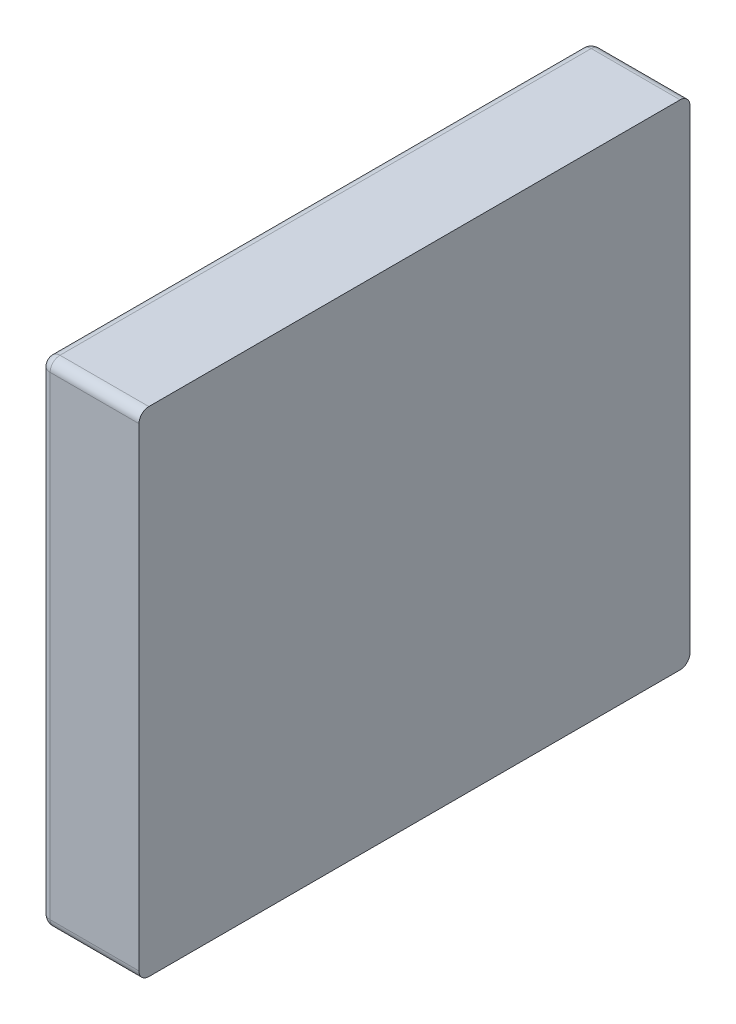
ISO-10303-21;
HEADER;
FILE_DESCRIPTION(('STEP AP214'),'2;1');
FILE_NAME('part.step','',(''),(''),'','','');
FILE_SCHEMA(('AUTOMOTIVE_DESIGN { 1 0 10303 214 1 1 1 1 }'));
ENDSEC;
DATA;
#1=APPLICATION_CONTEXT('core data for automotive mechanical design processes');
#2=APPLICATION_PROTOCOL_DEFINITION('international standard','automotive_design',2000,#1);
#3=PRODUCT_CONTEXT('',#1,'mechanical');
#4=PRODUCT('Part','Part','',(#3));
#5=PRODUCT_RELATED_PRODUCT_CATEGORY('part','',(#4));
#6=PRODUCT_DEFINITION_FORMATION('','',#4);
#7=PRODUCT_DEFINITION_CONTEXT('part definition',#1,'design');
#8=PRODUCT_DEFINITION('design','',#6,#7);
#9=PRODUCT_DEFINITION_SHAPE('','',#8);
#10=(LENGTH_UNIT() NAMED_UNIT(*) SI_UNIT(.MILLI.,.METRE.));
#11=(NAMED_UNIT(*) PLANE_ANGLE_UNIT() SI_UNIT($,.RADIAN.));
#12=(NAMED_UNIT(*) SI_UNIT($,.STERADIAN.) SOLID_ANGLE_UNIT());
#13=UNCERTAINTY_MEASURE_WITH_UNIT(LENGTH_MEASURE(1.E-05),#10,'distance_accuracy_value','');
#14=(GEOMETRIC_REPRESENTATION_CONTEXT(3) GLOBAL_UNCERTAINTY_ASSIGNED_CONTEXT((#13)) GLOBAL_UNIT_ASSIGNED_CONTEXT((#10,
#11,#12)) REPRESENTATION_CONTEXT('',''));
#15=CARTESIAN_POINT('',(0.,0.,0.));
#16=DIRECTION('',(0.,0.,1.));
#17=DIRECTION('',(1.,0.,0.));
#18=AXIS2_PLACEMENT_3D('',#15,#16,#17);
#19=CARTESIAN_POINT('',(1.65,1.25,0.));
#20=DIRECTION('',(0.,1.,0.));
#21=DIRECTION('',(-1.,0.,0.));
#22=AXIS2_PLACEMENT_3D('',#19,#20,#21);
#23=PLANE('',#22);
#24=DIRECTION('',(0.,0.,-1.));
#25=VECTOR('',#24,1.);
#26=CARTESIAN_POINT('',(-1.15,1.25,1.395));
#27=LINE('',#26,#25);
#28=CARTESIAN_POINT('',(-1.15,1.25,2.74));
#29=VERTEX_POINT('',#28);
#30=CARTESIAN_POINT('',(-1.15,1.25,0.05));
#31=VERTEX_POINT('',#30);
#32=EDGE_CURVE('E11',#29,#31,#27,.T.);
#33=ORIENTED_EDGE('',*,*,#32,.T.);
#34=DIRECTION('',(1.,0.,0.));
#35=VECTOR('',#34,1.);
#36=CARTESIAN_POINT('',(0.825,1.25,0.05));
#37=LINE('',#36,#35);
#38=CARTESIAN_POINT('',(-1.6,1.25,0.05));
#39=VERTEX_POINT('',#38);
#40=EDGE_CURVE('E24',#39,#31,#37,.T.);
#41=ORIENTED_EDGE('',*,*,#40,.F.);
#42=DIRECTION('',(0.,0.,-1.));
#43=VECTOR('',#42,1.);
#44=CARTESIAN_POINT('',(-1.6,1.25,0.));
#45=LINE('',#44,#43);
#46=CARTESIAN_POINT('',(-1.6,1.25,2.74));
#47=VERTEX_POINT('',#46);
#48=EDGE_CURVE('E265',#47,#39,#45,.T.);
#49=ORIENTED_EDGE('',*,*,#48,.F.);
#50=DIRECTION('',(-1.,0.,0.));
#51=VECTOR('',#50,1.);
#52=CARTESIAN_POINT('',(0.825,1.25,2.74));
#53=LINE('',#52,#51);
#54=EDGE_CURVE('E268',#29,#47,#53,.T.);
#55=ORIENTED_EDGE('',*,*,#54,.F.);
#56=EDGE_LOOP('',(#33,#41,#49,#55));
#57=FACE_BOUND('',#56,.T.);
#58=ADVANCED_FACE('F17',(#57),#23,.T.);
#59=CARTESIAN_POINT('',(-1.6,1.2,0.));
#60=DIRECTION('',(0.,0.,1.));
#61=DIRECTION('',(-0.707106781186548,0.707106781186548,0.));
#62=AXIS2_PLACEMENT_3D('',#59,#60,#61);
#63=CYLINDRICAL_SURFACE('',#62,0.05);
#64=CARTESIAN_POINT('',(-1.6,1.2,0.05));
#65=DIRECTION('',(0.,0.,-1.));
#66=DIRECTION('',(-0.707106781186546,0.707106781186549,0.));
#67=AXIS2_PLACEMENT_3D('',#64,#65,#66);
#68=CIRCLE('',#67,0.0499999999999999);
#69=CARTESIAN_POINT('',(-1.65,1.2,0.05));
#70=VERTEX_POINT('',#69);
#71=EDGE_CURVE('E260',#70,#39,#68,.T.);
#72=ORIENTED_EDGE('',*,*,#71,.F.);
#73=DIRECTION('',(0.,0.,1.));
#74=VECTOR('',#73,1.);
#75=CARTESIAN_POINT('',(-1.65,1.2,0.));
#76=LINE('',#75,#74);
#77=CARTESIAN_POINT('',(-1.65,1.2,2.74));
#78=VERTEX_POINT('',#77);
#79=EDGE_CURVE('E263',#70,#78,#76,.T.);
#80=ORIENTED_EDGE('',*,*,#79,.T.);
#81=CARTESIAN_POINT('',(-1.6,1.2,2.74));
#82=DIRECTION('',(0.,0.,1.));
#83=DIRECTION('',(-0.707106781186546,0.707106781186549,0.));
#84=AXIS2_PLACEMENT_3D('',#81,#82,#83);
#85=CIRCLE('',#84,0.0499999999999999);
#86=EDGE_CURVE('E275',#47,#78,#85,.T.);
#87=ORIENTED_EDGE('',*,*,#86,.F.);
#88=ORIENTED_EDGE('',*,*,#48,.T.);
#89=EDGE_LOOP('',(#72,#80,#87,#88));
#90=FACE_BOUND('',#89,.T.);
#91=ADVANCED_FACE('F250',(#90),#63,.T.);
#92=CARTESIAN_POINT('',(-1.65,1.25,0.));
#93=DIRECTION('',(-1.,0.,0.));
#94=DIRECTION('',(0.,-1.,0.));
#95=AXIS2_PLACEMENT_3D('',#92,#93,#94);
#96=PLANE('',#95);
#97=DIRECTION('',(0.,1.,0.));
#98=VECTOR('',#97,1.);
#99=CARTESIAN_POINT('',(-1.65,0.624999999999999,0.05));
#100=LINE('',#99,#98);
#101=CARTESIAN_POINT('',(-1.65,-1.2,0.05));
#102=VERTEX_POINT('',#101);
#103=EDGE_CURVE('E271',#102,#70,#100,.T.);
#104=ORIENTED_EDGE('',*,*,#103,.F.);
#105=DIRECTION('',(0.,0.,-1.));
#106=VECTOR('',#105,1.);
#107=CARTESIAN_POINT('',(-1.65,-1.2,0.));
#108=LINE('',#107,#106);
#109=CARTESIAN_POINT('',(-1.65,-1.2,2.74));
#110=VERTEX_POINT('',#109);
#111=EDGE_CURVE('E278',#110,#102,#108,.T.);
#112=ORIENTED_EDGE('',*,*,#111,.F.);
#113=DIRECTION('',(0.,-1.,0.));
#114=VECTOR('',#113,1.);
#115=CARTESIAN_POINT('',(-1.65,0.624999999999999,2.74));
#116=LINE('',#115,#114);
#117=EDGE_CURVE('E274',#78,#110,#116,.T.);
#118=ORIENTED_EDGE('',*,*,#117,.F.);
#119=ORIENTED_EDGE('',*,*,#79,.F.);
#120=EDGE_LOOP('',(#104,#112,#118,#119));
#121=FACE_BOUND('',#120,.T.);
#122=ADVANCED_FACE('F246',(#121),#96,.T.);
#123=CARTESIAN_POINT('',(-1.6,-1.2,2.74));
#124=DIRECTION('',(0.408248290463864,-0.816496580927728,-0.408248290463859));
#125=DIRECTION('',(-0.577350269189629,-0.577350269189624,0.577350269189625));
#126=AXIS2_PLACEMENT_3D('',#123,#124,#125);
#127=SPHERICAL_SURFACE('',#126,0.05);
#128=CARTESIAN_POINT('',(-1.6,-1.2,2.74));
#129=DIRECTION('',(0.,1.,0.));
#130=DIRECTION('',(-1.,0.,0.));
#131=AXIS2_PLACEMENT_3D('',#128,#129,#130);
#132=CIRCLE('',#131,0.0499999999999998);
#133=CARTESIAN_POINT('',(-1.6,-1.2,2.79));
#134=VERTEX_POINT('',#133);
#135=EDGE_CURVE('E319',#110,#134,#132,.T.);
#136=ORIENTED_EDGE('',*,*,#135,.F.);
#137=CARTESIAN_POINT('',(-1.6,-1.2,2.74));
#138=DIRECTION('',(0.,0.,1.));
#139=DIRECTION('',(-0.707106781186546,-0.707106781186549,0.));
#140=AXIS2_PLACEMENT_3D('',#137,#138,#139);
#141=CIRCLE('',#140,0.0499999999999999);
#142=CARTESIAN_POINT('',(-1.6,-1.25,2.74));
#143=VERTEX_POINT('',#142);
#144=EDGE_CURVE('E317',#110,#143,#141,.T.);
#145=ORIENTED_EDGE('',*,*,#144,.T.);
#146=CARTESIAN_POINT('',(-1.6,-1.2,2.74));
#147=DIRECTION('',(1.,0.,0.));
#148=DIRECTION('',(0.,0.,1.));
#149=AXIS2_PLACEMENT_3D('',#146,#147,#148);
#150=CIRCLE('',#149,0.0500000000000001);
#151=EDGE_CURVE('E228',#134,#143,#150,.T.);
#152=ORIENTED_EDGE('',*,*,#151,.F.);
#153=EDGE_LOOP('',(#136,#145,#152));
#154=FACE_BOUND('',#153,.T.);
#155=ADVANCED_FACE('F235',(#154),#127,.T.);
#156=CARTESIAN_POINT('',(-1.6,1.2,2.74));
#157=DIRECTION('',(-0.408248290463864,-0.816496580927728,0.408248290463859));
#158=DIRECTION('',(-0.57735026918963,0.577350269189624,0.577350269189625));
#159=AXIS2_PLACEMENT_3D('',#156,#157,#158);
#160=SPHERICAL_SURFACE('',#159,0.05);
#161=CARTESIAN_POINT('',(-1.6,1.2,2.74));
#162=DIRECTION('',(1.,0.,0.));
#163=DIRECTION('',(0.,1.,0.));
#164=AXIS2_PLACEMENT_3D('',#161,#162,#163);
#165=CIRCLE('',#164,0.05);
#166=CARTESIAN_POINT('',(-1.6,1.2,2.79));
#167=VERTEX_POINT('',#166);
#168=EDGE_CURVE('E226',#47,#167,#165,.T.);
#169=ORIENTED_EDGE('',*,*,#168,.F.);
#170=ORIENTED_EDGE('',*,*,#86,.T.);
#171=CARTESIAN_POINT('',(-1.6,1.2,2.74));
#172=DIRECTION('',(0.,-1.,0.));
#173=DIRECTION('',(0.,0.,1.));
#174=AXIS2_PLACEMENT_3D('',#171,#172,#173);
#175=CIRCLE('',#174,0.05);
#176=EDGE_CURVE('E223',#167,#78,#175,.T.);
#177=ORIENTED_EDGE('',*,*,#176,.F.);
#178=EDGE_LOOP('',(#169,#170,#177));
#179=FACE_BOUND('',#178,.T.);
#180=ADVANCED_FACE('F245',(#179),#160,.T.);
#181=CARTESIAN_POINT('',(0.825,1.2,2.74));
#182=DIRECTION('',(-1.,0.,0.));
#183=DIRECTION('',(0.,0.707106781186548,0.707106781186548));
#184=AXIS2_PLACEMENT_3D('',#181,#182,#183);
#185=CYLINDRICAL_SURFACE('',#184,0.05);
#186=CARTESIAN_POINT('',(-1.15,1.2,2.74));
#187=DIRECTION('',(-1.,0.,0.));
#188=DIRECTION('',(0.,0.707106781186548,0.707106781186548));
#189=AXIS2_PLACEMENT_3D('',#186,#187,#188);
#190=CIRCLE('',#189,0.05);
#191=CARTESIAN_POINT('',(-1.15,1.2,2.79));
#192=VERTEX_POINT('',#191);
#193=EDGE_CURVE('E220',#192,#29,#190,.T.);
#194=ORIENTED_EDGE('',*,*,#193,.T.);
#195=ORIENTED_EDGE('',*,*,#54,.T.);
#196=ORIENTED_EDGE('',*,*,#168,.T.);
#197=DIRECTION('',(1.,0.,0.));
#198=VECTOR('',#197,1.);
#199=CARTESIAN_POINT('',(0.825,1.2,2.79));
#200=LINE('',#199,#198);
#201=EDGE_CURVE('E217',#167,#192,#200,.T.);
#202=ORIENTED_EDGE('',*,*,#201,.T.);
#203=EDGE_LOOP('',(#194,#195,#196,#202));
#204=FACE_BOUND('',#203,.T.);
#205=ADVANCED_FACE('F339',(#204),#185,.T.);
#206=CARTESIAN_POINT('',(-1.6,0.624999999999999,2.74));
#207=DIRECTION('',(0.,-1.,0.));
#208=DIRECTION('',(-0.707106781186548,0.,0.707106781186548));
#209=AXIS2_PLACEMENT_3D('',#206,#207,#208);
#210=CYLINDRICAL_SURFACE('',#209,0.05);
#211=ORIENTED_EDGE('',*,*,#176,.T.);
#212=ORIENTED_EDGE('',*,*,#117,.T.);
#213=ORIENTED_EDGE('',*,*,#135,.T.);
#214=DIRECTION('',(0.,1.,0.));
#215=VECTOR('',#214,1.);
#216=CARTESIAN_POINT('',(-1.6,0.624999999999999,2.79));
#217=LINE('',#216,#215);
#218=EDGE_CURVE('E212',#134,#167,#217,.T.);
#219=ORIENTED_EDGE('',*,*,#218,.T.);
#220=EDGE_LOOP('',(#211,#212,#213,#219));
#221=FACE_BOUND('',#220,.T.);
#222=ADVANCED_FACE('F347',(#221),#210,.T.);
#223=CARTESIAN_POINT('',(0.,0.,0.));
#224=DIRECTION('',(0.,0.,1.));
#225=DIRECTION('',(1.,0.,0.));
#226=AXIS2_PLACEMENT_3D('',#223,#224,#225);
#227=PLANE('',#226);
#228=DIRECTION('',(0.,-1.,0.));
#229=VECTOR('',#228,1.);
#230=CARTESIAN_POINT('',(-1.15,-0.705746188975897,0.));
#231=LINE('',#230,#229);
#232=CARTESIAN_POINT('',(-1.15,1.2,0.));
#233=VERTEX_POINT('',#232);
#234=CARTESIAN_POINT('',(-1.15,-1.2,0.));
#235=VERTEX_POINT('',#234);
#236=EDGE_CURVE('E210',#233,#235,#231,.T.);
#237=ORIENTED_EDGE('',*,*,#236,.T.);
#238=DIRECTION('',(1.,0.,0.));
#239=VECTOR('',#238,1.);
#240=CARTESIAN_POINT('',(-0.825,-1.2,0.));
#241=LINE('',#240,#239);
#242=CARTESIAN_POINT('',(-1.6,-1.2,0.));
#243=VERTEX_POINT('',#242);
#244=EDGE_CURVE('E95',#243,#235,#241,.T.);
#245=ORIENTED_EDGE('',*,*,#244,.F.);
#246=DIRECTION('',(0.,-1.,0.));
#247=VECTOR('',#246,1.);
#248=CARTESIAN_POINT('',(-1.6,0.624999999999999,0.));
#249=LINE('',#248,#247);
#250=CARTESIAN_POINT('',(-1.6,1.2,0.));
#251=VERTEX_POINT('',#250);
#252=EDGE_CURVE('E203',#251,#243,#249,.T.);
#253=ORIENTED_EDGE('',*,*,#252,.F.);
#254=DIRECTION('',(-1.,0.,0.));
#255=VECTOR('',#254,1.);
#256=CARTESIAN_POINT('',(0.825,1.2,0.));
#257=LINE('',#256,#255);
#258=EDGE_CURVE('E198',#233,#251,#257,.T.);
#259=ORIENTED_EDGE('',*,*,#258,.F.);
#260=EDGE_LOOP('',(#237,#245,#253,#259));
#261=FACE_BOUND('',#260,.T.);
#262=ADVANCED_FACE('F352',(#261),#227,.F.);
#263=CARTESIAN_POINT('',(-1.6,-1.2,0.));
#264=DIRECTION('',(0.,0.,1.));
#265=DIRECTION('',(-0.707106781186548,-0.707106781186548,0.));
#266=AXIS2_PLACEMENT_3D('',#263,#264,#265);
#267=CYLINDRICAL_SURFACE('',#266,0.05);
#268=CARTESIAN_POINT('',(-1.6,-1.2,0.05));
#269=DIRECTION('',(0.,0.,-1.));
#270=DIRECTION('',(-0.707106781186546,-0.707106781186549,0.));
#271=AXIS2_PLACEMENT_3D('',#268,#269,#270);
#272=CIRCLE('',#271,0.0499999999999999);
#273=CARTESIAN_POINT('',(-1.6,-1.25,0.05));
#274=VERTEX_POINT('',#273);
#275=EDGE_CURVE('E194',#274,#102,#272,.T.);
#276=ORIENTED_EDGE('',*,*,#275,.F.);
#277=DIRECTION('',(0.,0.,1.));
#278=VECTOR('',#277,1.);
#279=CARTESIAN_POINT('',(-1.6,-1.25,0.));
#280=LINE('',#279,#278);
#281=EDGE_CURVE('E106',#274,#143,#280,.T.);
#282=ORIENTED_EDGE('',*,*,#281,.T.);
#283=ORIENTED_EDGE('',*,*,#144,.F.);
#284=ORIENTED_EDGE('',*,*,#111,.T.);
#285=EDGE_LOOP('',(#276,#282,#283,#284));
#286=FACE_BOUND('',#285,.T.);
#287=ADVANCED_FACE('F155',(#286),#267,.T.);
#288=CARTESIAN_POINT('',(-1.6,-1.2,0.05));
#289=DIRECTION('',(0.408248290463864,0.40824829046386,-0.816496580927727));
#290=DIRECTION('',(-0.577350269189628,-0.577350269189625,-0.577350269189624));
#291=AXIS2_PLACEMENT_3D('',#288,#289,#290);
#292=SPHERICAL_SURFACE('',#291,0.05);
#293=CARTESIAN_POINT('',(-1.6,-1.2,0.05));
#294=DIRECTION('',(1.,0.,0.));
#295=DIRECTION('',(0.,-1.,0.));
#296=AXIS2_PLACEMENT_3D('',#293,#294,#295);
#297=CIRCLE('',#296,0.05);
#298=EDGE_CURVE('E189',#274,#243,#297,.T.);
#299=ORIENTED_EDGE('',*,*,#298,.F.);
#300=ORIENTED_EDGE('',*,*,#275,.T.);
#301=CARTESIAN_POINT('',(-1.6,-1.2,0.05));
#302=DIRECTION('',(0.,1.,0.));
#303=DIRECTION('',(0.,0.,-1.));
#304=AXIS2_PLACEMENT_3D('',#301,#302,#303);
#305=CIRCLE('',#304,0.05);
#306=EDGE_CURVE('E174',#243,#102,#305,.T.);
#307=ORIENTED_EDGE('',*,*,#306,.F.);
#308=EDGE_LOOP('',(#299,#300,#307));
#309=FACE_BOUND('',#308,.T.);
#310=ADVANCED_FACE('F148',(#309),#292,.T.);
#311=CARTESIAN_POINT('',(-1.6,1.2,0.05));
#312=DIRECTION('',(0.408248290463864,-0.408248290463864,-0.816496580927725));
#313=DIRECTION('',(-0.577350269189627,0.577350269189623,-0.577350269189627));
#314=AXIS2_PLACEMENT_3D('',#311,#312,#313);
#315=SPHERICAL_SURFACE('',#314,0.05);
#316=CARTESIAN_POINT('',(-1.6,1.2,0.05));
#317=DIRECTION('',(0.,-1.,0.));
#318=DIRECTION('',(-1.,0.,0.));
#319=AXIS2_PLACEMENT_3D('',#316,#317,#318);
#320=CIRCLE('',#319,0.05);
#321=EDGE_CURVE('E163',#70,#251,#320,.T.);
#322=ORIENTED_EDGE('',*,*,#321,.F.);
#323=ORIENTED_EDGE('',*,*,#71,.T.);
#324=CARTESIAN_POINT('',(-1.6,1.2,0.05));
#325=DIRECTION('',(1.,0.,0.));
#326=DIRECTION('',(0.,0.,-1.));
#327=AXIS2_PLACEMENT_3D('',#324,#325,#326);
#328=CIRCLE('',#327,0.05);
#329=EDGE_CURVE('E130',#251,#39,#328,.T.);
#330=ORIENTED_EDGE('',*,*,#329,.F.);
#331=EDGE_LOOP('',(#322,#323,#330));
#332=FACE_BOUND('',#331,.T.);
#333=ADVANCED_FACE('F137',(#332),#315,.T.);
#334=CARTESIAN_POINT('',(-1.6,0.624999999999999,0.05));
#335=DIRECTION('',(0.,-1.,0.));
#336=DIRECTION('',(-0.707106781186548,0.,-0.707106781186547));
#337=AXIS2_PLACEMENT_3D('',#334,#335,#336);
#338=CYLINDRICAL_SURFACE('',#337,0.05);
#339=ORIENTED_EDGE('',*,*,#321,.T.);
#340=ORIENTED_EDGE('',*,*,#252,.T.);
#341=ORIENTED_EDGE('',*,*,#306,.T.);
#342=ORIENTED_EDGE('',*,*,#103,.T.);
#343=EDGE_LOOP('',(#339,#340,#341,#342));
#344=FACE_BOUND('',#343,.T.);
#345=ADVANCED_FACE('F147',(#344),#338,.T.);
#346=CARTESIAN_POINT('',(0.825,1.2,0.05));
#347=DIRECTION('',(-1.,0.,0.));
#348=DIRECTION('',(0.,0.707106781186548,-0.707106781186547));
#349=AXIS2_PLACEMENT_3D('',#346,#347,#348);
#350=CYLINDRICAL_SURFACE('',#349,0.05);
#351=CARTESIAN_POINT('',(-1.15,1.2,0.05));
#352=DIRECTION('',(-1.,0.,0.));
#353=DIRECTION('',(0.,0.707106781186548,-0.707106781186547));
#354=AXIS2_PLACEMENT_3D('',#351,#352,#353);
#355=CIRCLE('',#354,0.05);
#356=EDGE_CURVE('E127',#31,#233,#355,.T.);
#357=ORIENTED_EDGE('',*,*,#356,.T.);
#358=ORIENTED_EDGE('',*,*,#258,.T.);
#359=ORIENTED_EDGE('',*,*,#329,.T.);
#360=ORIENTED_EDGE('',*,*,#40,.T.);
#361=EDGE_LOOP('',(#357,#358,#359,#360));
#362=FACE_BOUND('',#361,.T.);
#363=ADVANCED_FACE('F282',(#362),#350,.T.);
#364=CARTESIAN_POINT('',(0.,0.,2.79));
#365=DIRECTION('',(0.,0.,1.));
#366=DIRECTION('',(1.,0.,0.));
#367=AXIS2_PLACEMENT_3D('',#364,#365,#366);
#368=PLANE('',#367);
#369=DIRECTION('',(0.,1.,0.));
#370=VECTOR('',#369,1.);
#371=CARTESIAN_POINT('',(-1.15,-0.705746188975897,2.79));
#372=LINE('',#371,#370);
#373=CARTESIAN_POINT('',(-1.15,-1.2,2.79));
#374=VERTEX_POINT('',#373);
#375=EDGE_CURVE('E124',#374,#192,#372,.T.);
#376=ORIENTED_EDGE('',*,*,#375,.T.);
#377=ORIENTED_EDGE('',*,*,#201,.F.);
#378=ORIENTED_EDGE('',*,*,#218,.F.);
#379=DIRECTION('',(-1.,0.,0.));
#380=VECTOR('',#379,1.);
#381=CARTESIAN_POINT('',(-0.825,-1.2,2.79));
#382=LINE('',#381,#380);
#383=EDGE_CURVE('E119',#374,#134,#382,.T.);
#384=ORIENTED_EDGE('',*,*,#383,.F.);
#385=EDGE_LOOP('',(#376,#377,#378,#384));
#386=FACE_BOUND('',#385,.T.);
#387=ADVANCED_FACE('F295',(#386),#368,.T.);
#388=CARTESIAN_POINT('',(-0.825,-1.2,2.74));
#389=DIRECTION('',(1.,0.,0.));
#390=DIRECTION('',(0.,-0.707106781186549,0.707106781186546));
#391=AXIS2_PLACEMENT_3D('',#388,#389,#390);
#392=CYLINDRICAL_SURFACE('',#391,0.05);
#393=CARTESIAN_POINT('',(-1.15,-1.2,2.74));
#394=DIRECTION('',(-1.,0.,0.));
#395=DIRECTION('',(0.,-0.707106781186549,0.707106781186546));
#396=AXIS2_PLACEMENT_3D('',#393,#394,#395);
#397=CIRCLE('',#396,0.05);
#398=CARTESIAN_POINT('',(-1.15,-1.25,2.74));
#399=VERTEX_POINT('',#398);
#400=EDGE_CURVE('E111',#399,#374,#397,.T.);
#401=ORIENTED_EDGE('',*,*,#400,.T.);
#402=ORIENTED_EDGE('',*,*,#383,.T.);
#403=ORIENTED_EDGE('',*,*,#151,.T.);
#404=DIRECTION('',(1.,0.,0.));
#405=VECTOR('',#404,1.);
#406=CARTESIAN_POINT('',(-0.825,-1.25,2.74));
#407=LINE('',#406,#405);
#408=EDGE_CURVE('E97',#143,#399,#407,.T.);
#409=ORIENTED_EDGE('',*,*,#408,.T.);
#410=EDGE_LOOP('',(#401,#402,#403,#409));
#411=FACE_BOUND('',#410,.T.);
#412=ADVANCED_FACE('F298',(#411),#392,.T.);
#413=CARTESIAN_POINT('',(-0.825,-1.2,0.05));
#414=DIRECTION('',(1.,0.,0.));
#415=DIRECTION('',(0.,-0.70710678118655,-0.707106781186545));
#416=AXIS2_PLACEMENT_3D('',#413,#414,#415);
#417=CYLINDRICAL_SURFACE('',#416,0.05);
#418=CARTESIAN_POINT('',(-1.15,-1.2,0.05));
#419=DIRECTION('',(-1.,0.,0.));
#420=DIRECTION('',(0.,-0.70710678118655,-0.707106781186545));
#421=AXIS2_PLACEMENT_3D('',#418,#419,#420);
#422=CIRCLE('',#421,0.05);
#423=CARTESIAN_POINT('',(-1.15,-1.25,0.05));
#424=VERTEX_POINT('',#423);
#425=EDGE_CURVE('E90',#235,#424,#422,.T.);
#426=ORIENTED_EDGE('',*,*,#425,.T.);
#427=DIRECTION('',(-1.,0.,0.));
#428=VECTOR('',#427,1.);
#429=CARTESIAN_POINT('',(-0.825,-1.25,0.05));
#430=LINE('',#429,#428);
#431=EDGE_CURVE('E94',#424,#274,#430,.T.);
#432=ORIENTED_EDGE('',*,*,#431,.T.);
#433=ORIENTED_EDGE('',*,*,#298,.T.);
#434=ORIENTED_EDGE('',*,*,#244,.T.);
#435=EDGE_LOOP('',(#426,#432,#433,#434));
#436=FACE_BOUND('',#435,.T.);
#437=ADVANCED_FACE('F92',(#436),#417,.T.);
#438=CARTESIAN_POINT('',(-1.65,-1.25,0.));
#439=DIRECTION('',(0.,-1.,0.));
#440=DIRECTION('',(1.,0.,0.));
#441=AXIS2_PLACEMENT_3D('',#438,#439,#440);
#442=PLANE('',#441);
#443=DIRECTION('',(0.,0.,1.));
#444=VECTOR('',#443,1.);
#445=CARTESIAN_POINT('',(-1.15,-1.25,1.395));
#446=LINE('',#445,#444);
#447=EDGE_CURVE('E104',#424,#399,#446,.T.);
#448=ORIENTED_EDGE('',*,*,#447,.T.);
#449=ORIENTED_EDGE('',*,*,#408,.F.);
#450=ORIENTED_EDGE('',*,*,#281,.F.);
#451=ORIENTED_EDGE('',*,*,#431,.F.);
#452=EDGE_LOOP('',(#448,#449,#450,#451));
#453=FACE_BOUND('',#452,.T.);
#454=ADVANCED_FACE('F102',(#453),#442,.T.);
#455=CARTESIAN_POINT('',(-1.15,-1.411492377952,2.79));
#456=DIRECTION('',(-1.,0.,0.));
#457=DIRECTION('',(0.,1.,0.));
#458=AXIS2_PLACEMENT_3D('',#455,#456,#457);
#459=PLANE('',#458);
#460=ORIENTED_EDGE('',*,*,#400,.F.);
#461=ORIENTED_EDGE('',*,*,#447,.F.);
#462=ORIENTED_EDGE('',*,*,#425,.F.);
#463=ORIENTED_EDGE('',*,*,#236,.F.);
#464=ORIENTED_EDGE('',*,*,#356,.F.);
#465=ORIENTED_EDGE('',*,*,#32,.F.);
#466=ORIENTED_EDGE('',*,*,#193,.F.);
#467=ORIENTED_EDGE('',*,*,#375,.F.);
#468=EDGE_LOOP('',(#460,#461,#462,#463,#464,#465,#466,#467));
#469=FACE_BOUND('',#468,.T.);
#470=ADVANCED_FACE('F109',(#469),#459,.F.);
#471=CLOSED_SHELL('',(#58,#91,#122,#155,#180,#205,#222,#262,#287,#310,#333,#345,#363,#387,#412,
#437,#454,#470));
#472=MANIFOLD_SOLID_BREP('B1',#471);
#473=ADVANCED_BREP_SHAPE_REPRESENTATION('',(#18,#472),#14);
#474=SHAPE_DEFINITION_REPRESENTATION(#9,#473);
ENDSEC;
END-ISO-10303-21;
